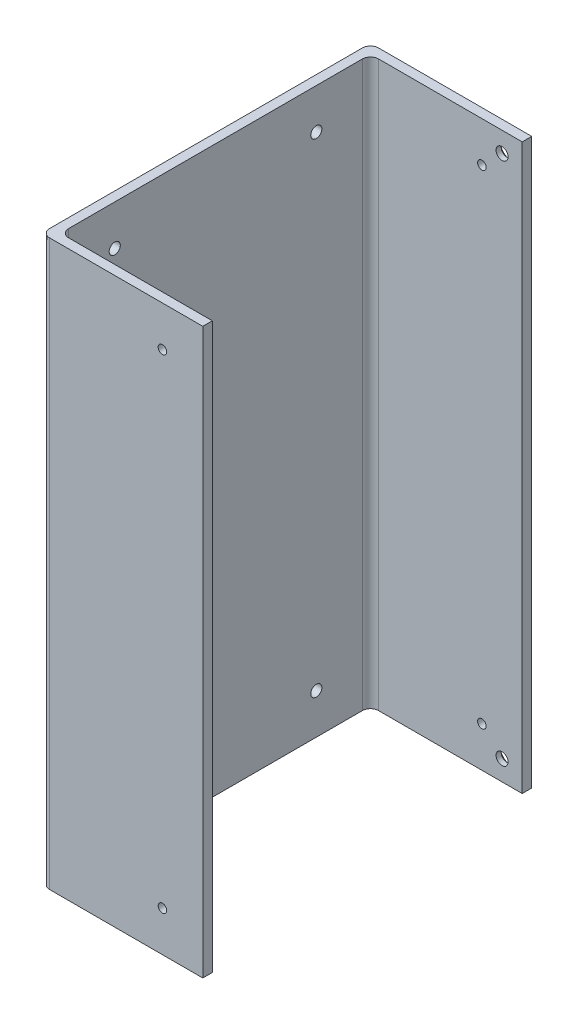
ISO-10303-21;
HEADER;
FILE_DESCRIPTION(('STEP AP214'),'2;1');
FILE_NAME('part.step','',(''),(''),'','','');
FILE_SCHEMA(('AUTOMOTIVE_DESIGN { 1 0 10303 214 1 1 1 1 }'));
ENDSEC;
DATA;
#1=APPLICATION_CONTEXT('core data for automotive mechanical design processes');
#2=APPLICATION_PROTOCOL_DEFINITION('international standard','automotive_design',2000,#1);
#3=PRODUCT_CONTEXT('',#1,'mechanical');
#4=PRODUCT('Part','Part','',(#3));
#5=PRODUCT_RELATED_PRODUCT_CATEGORY('part','',(#4));
#6=PRODUCT_DEFINITION_FORMATION('','',#4);
#7=PRODUCT_DEFINITION_CONTEXT('part definition',#1,'design');
#8=PRODUCT_DEFINITION('design','',#6,#7);
#9=PRODUCT_DEFINITION_SHAPE('','',#8);
#10=(LENGTH_UNIT() NAMED_UNIT(*) SI_UNIT(.MILLI.,.METRE.));
#11=(NAMED_UNIT(*) PLANE_ANGLE_UNIT() SI_UNIT($,.RADIAN.));
#12=(NAMED_UNIT(*) SI_UNIT($,.STERADIAN.) SOLID_ANGLE_UNIT());
#13=UNCERTAINTY_MEASURE_WITH_UNIT(LENGTH_MEASURE(1.E-05),#10,'distance_accuracy_value','');
#14=(GEOMETRIC_REPRESENTATION_CONTEXT(3) GLOBAL_UNCERTAINTY_ASSIGNED_CONTEXT((#13)) GLOBAL_UNIT_ASSIGNED_CONTEXT((#10,
#11,#12)) REPRESENTATION_CONTEXT('',''));
#15=CARTESIAN_POINT('',(0.,0.,0.));
#16=DIRECTION('',(0.,0.,1.));
#17=DIRECTION('',(1.,0.,0.));
#18=AXIS2_PLACEMENT_3D('',#15,#16,#17);
#19=CARTESIAN_POINT('',(50.8,-177.8,0.));
#20=DIRECTION('',(1.,0.,0.));
#21=DIRECTION('',(0.,0.,-1.));
#22=AXIS2_PLACEMENT_3D('',#19,#20,#21);
#23=PLANE('',#22);
#24=DIRECTION('',(0.,0.,-1.));
#25=VECTOR('',#24,1.);
#26=CARTESIAN_POINT('',(50.8,0.,0.));
#27=LINE('',#26,#25);
#28=CARTESIAN_POINT('',(50.8,0.,3.));
#29=VERTEX_POINT('',#28);
#30=CARTESIAN_POINT('',(50.8,0.,0.));
#31=VERTEX_POINT('',#30);
#32=EDGE_CURVE('E123',#29,#31,#27,.T.);
#33=ORIENTED_EDGE('',*,*,#32,.F.);
#34=DIRECTION('',(0.,1.,0.));
#35=VECTOR('',#34,1.);
#36=CARTESIAN_POINT('',(50.8,-177.8,3.));
#37=LINE('',#36,#35);
#38=CARTESIAN_POINT('',(50.8,-177.8,3.));
#39=VERTEX_POINT('',#38);
#40=EDGE_CURVE('E11',#39,#29,#37,.T.);
#41=ORIENTED_EDGE('',*,*,#40,.F.);
#42=DIRECTION('',(0.,0.,-1.));
#43=VECTOR('',#42,1.);
#44=CARTESIAN_POINT('',(50.8,-177.8,0.));
#45=LINE('',#44,#43);
#46=CARTESIAN_POINT('',(50.8,-177.8,0.));
#47=VERTEX_POINT('',#46);
#48=EDGE_CURVE('E125',#39,#47,#45,.T.);
#49=ORIENTED_EDGE('',*,*,#48,.T.);
#50=DIRECTION('',(0.,1.,0.));
#51=VECTOR('',#50,1.);
#52=CARTESIAN_POINT('',(50.8,-177.8,0.));
#53=LINE('',#52,#51);
#54=EDGE_CURVE('E120',#47,#31,#53,.T.);
#55=ORIENTED_EDGE('',*,*,#54,.T.);
#56=EDGE_LOOP('',(#33,#41,#49,#55));
#57=FACE_BOUND('',#56,.T.);
#58=ADVANCED_FACE('F34',(#57),#23,.T.);
#59=CARTESIAN_POINT('',(5.54000000000002,-177.8,3.));
#60=DIRECTION('',(0.,0.,1.));
#61=DIRECTION('',(1.,0.,0.));
#62=AXIS2_PLACEMENT_3D('',#59,#60,#61);
#63=PLANE('',#62);
#64=CARTESIAN_POINT('',(44.45,-171.45,3.));
#65=DIRECTION('',(0.,0.,1.));
#66=DIRECTION('',(1.,0.,0.));
#67=AXIS2_PLACEMENT_3D('',#64,#65,#66);
#68=CIRCLE('',#67,1.89864999999999);
#69=CARTESIAN_POINT('',(46.34865,-171.45,3.));
#70=VERTEX_POINT('',#69);
#71=EDGE_CURVE('E37',#70,#70,#68,.T.);
#72=ORIENTED_EDGE('',*,*,#71,.F.);
#73=EDGE_LOOP('',(#72));
#74=FACE_BOUND('',#73,.T.);
#75=CARTESIAN_POINT('',(44.45,-6.34999999999999,3.));
#76=DIRECTION('',(0.,0.,1.));
#77=DIRECTION('',(1.,0.,0.));
#78=AXIS2_PLACEMENT_3D('',#75,#76,#77);
#79=CIRCLE('',#78,1.89864999999999);
#80=CARTESIAN_POINT('',(46.34865,-6.34999999999999,3.));
#81=VERTEX_POINT('',#80);
#82=EDGE_CURVE('E228',#81,#81,#79,.T.);
#83=ORIENTED_EDGE('',*,*,#82,.F.);
#84=EDGE_LOOP('',(#83));
#85=FACE_BOUND('',#84,.T.);
#86=CARTESIAN_POINT('',(38.1,-12.7,3.));
#87=DIRECTION('',(0.,0.,1.));
#88=DIRECTION('',(1.,0.,0.));
#89=AXIS2_PLACEMENT_3D('',#86,#87,#88);
#90=CIRCLE('',#89,1.35255);
#91=CARTESIAN_POINT('',(39.45255,-12.7,3.));
#92=VERTEX_POINT('',#91);
#93=EDGE_CURVE('E257',#92,#92,#90,.T.);
#94=ORIENTED_EDGE('',*,*,#93,.F.);
#95=EDGE_LOOP('',(#94));
#96=FACE_BOUND('',#95,.T.);
#97=CARTESIAN_POINT('',(38.1,-165.1,3.));
#98=DIRECTION('',(0.,0.,1.));
#99=DIRECTION('',(1.,0.,0.));
#100=AXIS2_PLACEMENT_3D('',#97,#98,#99);
#101=CIRCLE('',#100,1.35255);
#102=CARTESIAN_POINT('',(39.45255,-165.1,3.));
#103=VERTEX_POINT('',#102);
#104=EDGE_CURVE('E224',#103,#103,#101,.T.);
#105=ORIENTED_EDGE('',*,*,#104,.F.);
#106=EDGE_LOOP('',(#105));
#107=FACE_BOUND('',#106,.T.);
#108=DIRECTION('',(1.,0.,0.));
#109=VECTOR('',#108,1.);
#110=CARTESIAN_POINT('',(5.54000000000002,0.,3.));
#111=LINE('',#110,#109);
#112=CARTESIAN_POINT('',(5.54000000000002,0.,3.));
#113=VERTEX_POINT('',#112);
#114=EDGE_CURVE('E142',#113,#29,#111,.T.);
#115=ORIENTED_EDGE('',*,*,#114,.F.);
#116=DIRECTION('',(0.,1.,0.));
#117=VECTOR('',#116,1.);
#118=CARTESIAN_POINT('',(5.54000000000002,-177.8,3.));
#119=LINE('',#118,#117);
#120=CARTESIAN_POINT('',(5.54000000000002,-177.8,3.));
#121=VERTEX_POINT('',#120);
#122=EDGE_CURVE('E42',#121,#113,#119,.T.);
#123=ORIENTED_EDGE('',*,*,#122,.F.);
#124=DIRECTION('',(1.,0.,0.));
#125=VECTOR('',#124,1.);
#126=CARTESIAN_POINT('',(5.54000000000002,-177.8,3.));
#127=LINE('',#126,#125);
#128=EDGE_CURVE('E130',#121,#39,#127,.T.);
#129=ORIENTED_EDGE('',*,*,#128,.T.);
#130=ORIENTED_EDGE('',*,*,#40,.T.);
#131=EDGE_LOOP('',(#115,#123,#129,#130));
#132=FACE_BOUND('',#131,.T.);
#133=ADVANCED_FACE('F324',(#74,#85,#96,#107,#132),#63,.T.);
#134=CARTESIAN_POINT('',(5.54,-177.8,5.54));
#135=DIRECTION('',(0.,1.,0.));
#136=DIRECTION('',(0.,0.,1.));
#137=AXIS2_PLACEMENT_3D('',#134,#135,#136);
#138=CYLINDRICAL_SURFACE('',#137,2.54);
#139=CARTESIAN_POINT('',(5.54,0.,5.54));
#140=DIRECTION('',(0.,-1.,0.));
#141=DIRECTION('',(0.,0.,-1.));
#142=AXIS2_PLACEMENT_3D('',#139,#140,#141);
#143=CIRCLE('',#142,2.54);
#144=CARTESIAN_POINT('',(3.,0.,5.54000000000002));
#145=VERTEX_POINT('',#144);
#146=EDGE_CURVE('E173',#145,#113,#143,.T.);
#147=ORIENTED_EDGE('',*,*,#146,.F.);
#148=DIRECTION('',(0.,1.,0.));
#149=VECTOR('',#148,1.);
#150=CARTESIAN_POINT('',(3.,-177.8,5.54000000000002));
#151=LINE('',#150,#149);
#152=CARTESIAN_POINT('',(3.,-177.8,5.54000000000002));
#153=VERTEX_POINT('',#152);
#154=EDGE_CURVE('E207',#153,#145,#151,.T.);
#155=ORIENTED_EDGE('',*,*,#154,.F.);
#156=CARTESIAN_POINT('',(5.54,-177.8,5.54));
#157=DIRECTION('',(0.,-1.,0.));
#158=DIRECTION('',(0.,0.,-1.));
#159=AXIS2_PLACEMENT_3D('',#156,#157,#158);
#160=CIRCLE('',#159,2.54);
#161=EDGE_CURVE('E203',#153,#121,#160,.T.);
#162=ORIENTED_EDGE('',*,*,#161,.T.);
#163=ORIENTED_EDGE('',*,*,#122,.T.);
#164=EDGE_LOOP('',(#147,#155,#162,#163));
#165=FACE_BOUND('',#164,.T.);
#166=ADVANCED_FACE('F323',(#165),#138,.F.);
#167=CARTESIAN_POINT('',(3.,-177.8,5.54000000000002));
#168=DIRECTION('',(1.,0.,0.));
#169=DIRECTION('',(0.,0.,-1.));
#170=AXIS2_PLACEMENT_3D('',#167,#168,#169);
#171=PLANE('',#170);
#172=CARTESIAN_POINT('',(3.,-12.7,20.066));
#173=DIRECTION('',(1.,0.,0.));
#174=DIRECTION('',(0.,0.,-1.));
#175=AXIS2_PLACEMENT_3D('',#172,#173,#174);
#176=CIRCLE('',#175,1.7526);
#177=CARTESIAN_POINT('',(3.,-12.7,18.3134));
#178=VERTEX_POINT('',#177);
#179=EDGE_CURVE('E264',#178,#178,#176,.T.);
#180=ORIENTED_EDGE('',*,*,#179,.F.);
#181=EDGE_LOOP('',(#180));
#182=FACE_BOUND('',#181,.T.);
#183=CARTESIAN_POINT('',(3.,-12.7,83.566));
#184=DIRECTION('',(1.,0.,0.));
#185=DIRECTION('',(0.,0.,-1.));
#186=AXIS2_PLACEMENT_3D('',#183,#184,#185);
#187=CIRCLE('',#186,1.7526);
#188=CARTESIAN_POINT('',(3.,-12.7,81.8134));
#189=VERTEX_POINT('',#188);
#190=EDGE_CURVE('E270',#189,#189,#187,.T.);
#191=ORIENTED_EDGE('',*,*,#190,.F.);
#192=EDGE_LOOP('',(#191));
#193=FACE_BOUND('',#192,.T.);
#194=CARTESIAN_POINT('',(3.,-165.1,83.566));
#195=DIRECTION('',(1.,0.,0.));
#196=DIRECTION('',(0.,0.,-1.));
#197=AXIS2_PLACEMENT_3D('',#194,#195,#196);
#198=CIRCLE('',#197,1.75259999999999);
#199=CARTESIAN_POINT('',(3.,-165.1,81.8134));
#200=VERTEX_POINT('',#199);
#201=EDGE_CURVE('E275',#200,#200,#198,.T.);
#202=ORIENTED_EDGE('',*,*,#201,.F.);
#203=EDGE_LOOP('',(#202));
#204=FACE_BOUND('',#203,.T.);
#205=CARTESIAN_POINT('',(3.,-165.1,20.066));
#206=DIRECTION('',(1.,0.,0.));
#207=DIRECTION('',(0.,0.,-1.));
#208=AXIS2_PLACEMENT_3D('',#205,#206,#207);
#209=CIRCLE('',#208,1.75259999999999);
#210=CARTESIAN_POINT('',(3.,-165.1,18.3134));
#211=VERTEX_POINT('',#210);
#212=EDGE_CURVE('E143',#211,#211,#209,.T.);
#213=ORIENTED_EDGE('',*,*,#212,.F.);
#214=EDGE_LOOP('',(#213));
#215=FACE_BOUND('',#214,.T.);
#216=DIRECTION('',(0.,0.,-1.));
#217=VECTOR('',#216,1.);
#218=CARTESIAN_POINT('',(3.,0.,5.54000000000002));
#219=LINE('',#218,#217);
#220=CARTESIAN_POINT('',(3.,0.,98.092));
#221=VERTEX_POINT('',#220);
#222=EDGE_CURVE('E170',#221,#145,#219,.T.);
#223=ORIENTED_EDGE('',*,*,#222,.F.);
#224=DIRECTION('',(0.,1.,0.));
#225=VECTOR('',#224,1.);
#226=CARTESIAN_POINT('',(3.,-177.8,98.092));
#227=LINE('',#226,#225);
#228=CARTESIAN_POINT('',(3.,-177.8,98.092));
#229=VERTEX_POINT('',#228);
#230=EDGE_CURVE('E209',#229,#221,#227,.T.);
#231=ORIENTED_EDGE('',*,*,#230,.F.);
#232=DIRECTION('',(0.,0.,-1.));
#233=VECTOR('',#232,1.);
#234=CARTESIAN_POINT('',(3.,-177.8,5.54000000000002));
#235=LINE('',#234,#233);
#236=EDGE_CURVE('E200',#229,#153,#235,.T.);
#237=ORIENTED_EDGE('',*,*,#236,.T.);
#238=ORIENTED_EDGE('',*,*,#154,.T.);
#239=EDGE_LOOP('',(#223,#231,#237,#238));
#240=FACE_BOUND('',#239,.T.);
#241=ADVANCED_FACE('F319',(#182,#193,#204,#215,#240),#171,.T.);
#242=CARTESIAN_POINT('',(5.54,-177.8,98.092));
#243=DIRECTION('',(0.,1.,0.));
#244=DIRECTION('',(0.,0.,1.));
#245=AXIS2_PLACEMENT_3D('',#242,#243,#244);
#246=CYLINDRICAL_SURFACE('',#245,2.54);
#247=CARTESIAN_POINT('',(5.54,0.,98.092));
#248=DIRECTION('',(0.,-1.,0.));
#249=DIRECTION('',(0.,0.,-1.));
#250=AXIS2_PLACEMENT_3D('',#247,#248,#249);
#251=CIRCLE('',#250,2.54);
#252=CARTESIAN_POINT('',(5.54000000000002,0.,100.632));
#253=VERTEX_POINT('',#252);
#254=EDGE_CURVE('E167',#253,#221,#251,.T.);
#255=ORIENTED_EDGE('',*,*,#254,.F.);
#256=DIRECTION('',(0.,1.,0.));
#257=VECTOR('',#256,1.);
#258=CARTESIAN_POINT('',(5.54000000000002,-177.8,100.632));
#259=LINE('',#258,#257);
#260=CARTESIAN_POINT('',(5.54000000000002,-177.8,100.632));
#261=VERTEX_POINT('',#260);
#262=EDGE_CURVE('E211',#261,#253,#259,.T.);
#263=ORIENTED_EDGE('',*,*,#262,.F.);
#264=CARTESIAN_POINT('',(5.54,-177.8,98.092));
#265=DIRECTION('',(0.,-1.,0.));
#266=DIRECTION('',(0.,0.,-1.));
#267=AXIS2_PLACEMENT_3D('',#264,#265,#266);
#268=CIRCLE('',#267,2.54);
#269=EDGE_CURVE('E197',#261,#229,#268,.T.);
#270=ORIENTED_EDGE('',*,*,#269,.T.);
#271=ORIENTED_EDGE('',*,*,#230,.T.);
#272=EDGE_LOOP('',(#255,#263,#270,#271));
#273=FACE_BOUND('',#272,.T.);
#274=ADVANCED_FACE('F315',(#273),#246,.F.);
#275=CARTESIAN_POINT('',(5.54000000000002,-177.8,100.632));
#276=DIRECTION('',(0.,0.,-1.));
#277=DIRECTION('',(-1.,0.,0.));
#278=AXIS2_PLACEMENT_3D('',#275,#276,#277);
#279=PLANE('',#278);
#280=CARTESIAN_POINT('',(38.1,-12.7,100.632));
#281=DIRECTION('',(0.,0.,-1.));
#282=DIRECTION('',(-1.,0.,0.));
#283=AXIS2_PLACEMENT_3D('',#280,#281,#282);
#284=CIRCLE('',#283,1.35254999999999);
#285=CARTESIAN_POINT('',(36.74745,-12.7,100.632));
#286=VERTEX_POINT('',#285);
#287=EDGE_CURVE('E235',#286,#286,#284,.T.);
#288=ORIENTED_EDGE('',*,*,#287,.F.);
#289=EDGE_LOOP('',(#288));
#290=FACE_BOUND('',#289,.T.);
#291=CARTESIAN_POINT('',(38.1,-165.1,100.632));
#292=DIRECTION('',(0.,0.,-1.));
#293=DIRECTION('',(-1.,0.,0.));
#294=AXIS2_PLACEMENT_3D('',#291,#292,#293);
#295=CIRCLE('',#294,1.35254999999999);
#296=CARTESIAN_POINT('',(36.74745,-165.1,100.632));
#297=VERTEX_POINT('',#296);
#298=EDGE_CURVE('E251',#297,#297,#295,.T.);
#299=ORIENTED_EDGE('',*,*,#298,.F.);
#300=EDGE_LOOP('',(#299));
#301=FACE_BOUND('',#300,.T.);
#302=DIRECTION('',(-1.,0.,0.));
#303=VECTOR('',#302,1.);
#304=CARTESIAN_POINT('',(5.54000000000002,0.,100.632));
#305=LINE('',#304,#303);
#306=CARTESIAN_POINT('',(50.8,0.,100.632));
#307=VERTEX_POINT('',#306);
#308=EDGE_CURVE('E164',#307,#253,#305,.T.);
#309=ORIENTED_EDGE('',*,*,#308,.F.);
#310=DIRECTION('',(0.,1.,0.));
#311=VECTOR('',#310,1.);
#312=CARTESIAN_POINT('',(50.8,-177.8,100.632));
#313=LINE('',#312,#311);
#314=CARTESIAN_POINT('',(50.8,-177.8,100.632));
#315=VERTEX_POINT('',#314);
#316=EDGE_CURVE('E213',#315,#307,#313,.T.);
#317=ORIENTED_EDGE('',*,*,#316,.F.);
#318=DIRECTION('',(-1.,0.,0.));
#319=VECTOR('',#318,1.);
#320=CARTESIAN_POINT('',(5.54000000000002,-177.8,100.632));
#321=LINE('',#320,#319);
#322=EDGE_CURVE('E194',#315,#261,#321,.T.);
#323=ORIENTED_EDGE('',*,*,#322,.T.);
#324=ORIENTED_EDGE('',*,*,#262,.T.);
#325=EDGE_LOOP('',(#309,#317,#323,#324));
#326=FACE_BOUND('',#325,.T.);
#327=ADVANCED_FACE('F311',(#290,#301,#326),#279,.T.);
#328=CARTESIAN_POINT('',(50.8,-177.8,100.632));
#329=DIRECTION('',(1.,0.,0.));
#330=DIRECTION('',(0.,0.,-1.));
#331=AXIS2_PLACEMENT_3D('',#328,#329,#330);
#332=PLANE('',#331);
#333=DIRECTION('',(0.,0.,-1.));
#334=VECTOR('',#333,1.);
#335=CARTESIAN_POINT('',(50.8,0.,100.632));
#336=LINE('',#335,#334);
#337=CARTESIAN_POINT('',(50.8,0.,103.632));
#338=VERTEX_POINT('',#337);
#339=EDGE_CURVE('E161',#338,#307,#336,.T.);
#340=ORIENTED_EDGE('',*,*,#339,.F.);
#341=DIRECTION('',(0.,1.,0.));
#342=VECTOR('',#341,1.);
#343=CARTESIAN_POINT('',(50.8,-177.8,103.632));
#344=LINE('',#343,#342);
#345=CARTESIAN_POINT('',(50.8,-177.8,103.632));
#346=VERTEX_POINT('',#345);
#347=EDGE_CURVE('E215',#346,#338,#344,.T.);
#348=ORIENTED_EDGE('',*,*,#347,.F.);
#349=DIRECTION('',(0.,0.,-1.));
#350=VECTOR('',#349,1.);
#351=CARTESIAN_POINT('',(50.8,-177.8,100.632));
#352=LINE('',#351,#350);
#353=EDGE_CURVE('E191',#346,#315,#352,.T.);
#354=ORIENTED_EDGE('',*,*,#353,.T.);
#355=ORIENTED_EDGE('',*,*,#316,.T.);
#356=EDGE_LOOP('',(#340,#348,#354,#355));
#357=FACE_BOUND('',#356,.T.);
#358=ADVANCED_FACE('F307',(#357),#332,.T.);
#359=CARTESIAN_POINT('',(2.54000000000003,-177.8,103.632));
#360=DIRECTION('',(0.,0.,1.));
#361=DIRECTION('',(1.,0.,0.));
#362=AXIS2_PLACEMENT_3D('',#359,#360,#361);
#363=PLANE('',#362);
#364=CARTESIAN_POINT('',(38.1,-12.7,103.632));
#365=DIRECTION('',(0.,0.,1.));
#366=DIRECTION('',(1.,0.,0.));
#367=AXIS2_PLACEMENT_3D('',#364,#365,#366);
#368=CIRCLE('',#367,1.35254999999999);
#369=CARTESIAN_POINT('',(39.45255,-12.7,103.632));
#370=VERTEX_POINT('',#369);
#371=EDGE_CURVE('E230',#370,#370,#368,.T.);
#372=ORIENTED_EDGE('',*,*,#371,.F.);
#373=EDGE_LOOP('',(#372));
#374=FACE_BOUND('',#373,.T.);
#375=CARTESIAN_POINT('',(38.1,-165.1,103.632));
#376=DIRECTION('',(0.,0.,1.));
#377=DIRECTION('',(1.,0.,0.));
#378=AXIS2_PLACEMENT_3D('',#375,#376,#377);
#379=CIRCLE('',#378,1.35254999999999);
#380=CARTESIAN_POINT('',(39.45255,-165.1,103.632));
#381=VERTEX_POINT('',#380);
#382=EDGE_CURVE('E248',#381,#381,#379,.T.);
#383=ORIENTED_EDGE('',*,*,#382,.F.);
#384=EDGE_LOOP('',(#383));
#385=FACE_BOUND('',#384,.T.);
#386=DIRECTION('',(1.,0.,0.));
#387=VECTOR('',#386,1.);
#388=CARTESIAN_POINT('',(2.54000000000003,0.,103.632));
#389=LINE('',#388,#387);
#390=CARTESIAN_POINT('',(2.54000000000003,0.,103.632));
#391=VERTEX_POINT('',#390);
#392=EDGE_CURVE('E158',#391,#338,#389,.T.);
#393=ORIENTED_EDGE('',*,*,#392,.F.);
#394=DIRECTION('',(0.,1.,0.));
#395=VECTOR('',#394,1.);
#396=CARTESIAN_POINT('',(2.54000000000003,-177.8,103.632));
#397=LINE('',#396,#395);
#398=CARTESIAN_POINT('',(2.54000000000003,-177.8,103.632));
#399=VERTEX_POINT('',#398);
#400=EDGE_CURVE('E217',#399,#391,#397,.T.);
#401=ORIENTED_EDGE('',*,*,#400,.F.);
#402=DIRECTION('',(1.,0.,0.));
#403=VECTOR('',#402,1.);
#404=CARTESIAN_POINT('',(2.54000000000003,-177.8,103.632));
#405=LINE('',#404,#403);
#406=EDGE_CURVE('E188',#399,#346,#405,.T.);
#407=ORIENTED_EDGE('',*,*,#406,.T.);
#408=ORIENTED_EDGE('',*,*,#347,.T.);
#409=EDGE_LOOP('',(#393,#401,#407,#408));
#410=FACE_BOUND('',#409,.T.);
#411=ADVANCED_FACE('F305',(#374,#385,#410),#363,.T.);
#412=CARTESIAN_POINT('',(2.54000000000001,-177.8,101.092));
#413=DIRECTION('',(0.,1.,0.));
#414=DIRECTION('',(0.,0.,1.));
#415=AXIS2_PLACEMENT_3D('',#412,#413,#414);
#416=CYLINDRICAL_SURFACE('',#415,2.54);
#417=CARTESIAN_POINT('',(2.54000000000001,0.,101.092));
#418=DIRECTION('',(0.,1.,0.));
#419=DIRECTION('',(0.,0.,1.));
#420=AXIS2_PLACEMENT_3D('',#417,#418,#419);
#421=CIRCLE('',#420,2.54);
#422=CARTESIAN_POINT('',(0.,0.,101.092));
#423=VERTEX_POINT('',#422);
#424=EDGE_CURVE('E155',#423,#391,#421,.T.);
#425=ORIENTED_EDGE('',*,*,#424,.F.);
#426=DIRECTION('',(0.,1.,0.));
#427=VECTOR('',#426,1.);
#428=CARTESIAN_POINT('',(0.,-177.8,101.092));
#429=LINE('',#428,#427);
#430=CARTESIAN_POINT('',(0.,-177.8,101.092));
#431=VERTEX_POINT('',#430);
#432=EDGE_CURVE('E219',#431,#423,#429,.T.);
#433=ORIENTED_EDGE('',*,*,#432,.F.);
#434=CARTESIAN_POINT('',(2.54000000000001,-177.8,101.092));
#435=DIRECTION('',(0.,1.,0.));
#436=DIRECTION('',(0.,0.,1.));
#437=AXIS2_PLACEMENT_3D('',#434,#435,#436);
#438=CIRCLE('',#437,2.54);
#439=EDGE_CURVE('E185',#431,#399,#438,.T.);
#440=ORIENTED_EDGE('',*,*,#439,.T.);
#441=ORIENTED_EDGE('',*,*,#400,.T.);
#442=EDGE_LOOP('',(#425,#433,#440,#441));
#443=FACE_BOUND('',#442,.T.);
#444=ADVANCED_FACE('F288',(#443),#416,.T.);
#445=CARTESIAN_POINT('',(0.,-177.8,2.54000000000002));
#446=DIRECTION('',(-1.,0.,0.));
#447=DIRECTION('',(0.,0.,1.));
#448=AXIS2_PLACEMENT_3D('',#445,#446,#447);
#449=PLANE('',#448);
#450=CARTESIAN_POINT('',(0.,-12.7,20.066));
#451=DIRECTION('',(-1.,0.,0.));
#452=DIRECTION('',(0.,0.,1.));
#453=AXIS2_PLACEMENT_3D('',#450,#451,#452);
#454=CIRCLE('',#453,1.7526);
#455=CARTESIAN_POINT('',(0.,-12.7,21.8186));
#456=VERTEX_POINT('',#455);
#457=EDGE_CURVE('E226',#456,#456,#454,.T.);
#458=ORIENTED_EDGE('',*,*,#457,.F.);
#459=EDGE_LOOP('',(#458));
#460=FACE_BOUND('',#459,.T.);
#461=CARTESIAN_POINT('',(0.,-12.7,83.566));
#462=DIRECTION('',(-1.,0.,0.));
#463=DIRECTION('',(0.,0.,1.));
#464=AXIS2_PLACEMENT_3D('',#461,#462,#463);
#465=CIRCLE('',#464,1.7526);
#466=CARTESIAN_POINT('',(0.,-12.7,85.3186));
#467=VERTEX_POINT('',#466);
#468=EDGE_CURVE('E267',#467,#467,#465,.T.);
#469=ORIENTED_EDGE('',*,*,#468,.F.);
#470=EDGE_LOOP('',(#469));
#471=FACE_BOUND('',#470,.T.);
#472=CARTESIAN_POINT('',(0.,-165.1,83.566));
#473=DIRECTION('',(-1.,0.,0.));
#474=DIRECTION('',(0.,0.,1.));
#475=AXIS2_PLACEMENT_3D('',#472,#473,#474);
#476=CIRCLE('',#475,1.75259999999999);
#477=CARTESIAN_POINT('',(0.,-165.1,85.3186));
#478=VERTEX_POINT('',#477);
#479=EDGE_CURVE('E273',#478,#478,#476,.T.);
#480=ORIENTED_EDGE('',*,*,#479,.F.);
#481=EDGE_LOOP('',(#480));
#482=FACE_BOUND('',#481,.T.);
#483=CARTESIAN_POINT('',(0.,-165.1,20.066));
#484=DIRECTION('',(-1.,0.,0.));
#485=DIRECTION('',(0.,0.,1.));
#486=AXIS2_PLACEMENT_3D('',#483,#484,#485);
#487=CIRCLE('',#486,1.75259999999999);
#488=CARTESIAN_POINT('',(0.,-165.1,21.8186));
#489=VERTEX_POINT('',#488);
#490=EDGE_CURVE('E146',#489,#489,#487,.T.);
#491=ORIENTED_EDGE('',*,*,#490,.F.);
#492=EDGE_LOOP('',(#491));
#493=FACE_BOUND('',#492,.T.);
#494=DIRECTION('',(0.,0.,1.));
#495=VECTOR('',#494,1.);
#496=CARTESIAN_POINT('',(0.,0.,2.54000000000002));
#497=LINE('',#496,#495);
#498=CARTESIAN_POINT('',(0.,0.,2.54000000000002));
#499=VERTEX_POINT('',#498);
#500=EDGE_CURVE('E152',#499,#423,#497,.T.);
#501=ORIENTED_EDGE('',*,*,#500,.F.);
#502=DIRECTION('',(0.,1.,0.));
#503=VECTOR('',#502,1.);
#504=CARTESIAN_POINT('',(0.,-177.8,2.54000000000002));
#505=LINE('',#504,#503);
#506=CARTESIAN_POINT('',(0.,-177.8,2.54000000000002));
#507=VERTEX_POINT('',#506);
#508=EDGE_CURVE('E221',#507,#499,#505,.T.);
#509=ORIENTED_EDGE('',*,*,#508,.F.);
#510=DIRECTION('',(0.,0.,1.));
#511=VECTOR('',#510,1.);
#512=CARTESIAN_POINT('',(0.,-177.8,2.54000000000002));
#513=LINE('',#512,#511);
#514=EDGE_CURVE('E182',#507,#431,#513,.T.);
#515=ORIENTED_EDGE('',*,*,#514,.T.);
#516=ORIENTED_EDGE('',*,*,#432,.T.);
#517=EDGE_LOOP('',(#501,#509,#515,#516));
#518=FACE_BOUND('',#517,.T.);
#519=ADVANCED_FACE('F284',(#460,#471,#482,#493,#518),#449,.T.);
#520=CARTESIAN_POINT('',(2.54,-177.8,2.54));
#521=DIRECTION('',(0.,1.,0.));
#522=DIRECTION('',(0.,0.,1.));
#523=AXIS2_PLACEMENT_3D('',#520,#521,#522);
#524=CYLINDRICAL_SURFACE('',#523,2.54);
#525=CARTESIAN_POINT('',(2.54,0.,2.54));
#526=DIRECTION('',(0.,1.,0.));
#527=DIRECTION('',(0.,0.,-1.));
#528=AXIS2_PLACEMENT_3D('',#525,#526,#527);
#529=CIRCLE('',#528,2.54);
#530=CARTESIAN_POINT('',(2.54000000000002,0.,0.));
#531=VERTEX_POINT('',#530);
#532=EDGE_CURVE('E138',#531,#499,#529,.T.);
#533=ORIENTED_EDGE('',*,*,#532,.F.);
#534=DIRECTION('',(0.,1.,0.));
#535=VECTOR('',#534,1.);
#536=CARTESIAN_POINT('',(2.54000000000002,-177.8,0.));
#537=LINE('',#536,#535);
#538=CARTESIAN_POINT('',(2.54000000000002,-177.8,0.));
#539=VERTEX_POINT('',#538);
#540=EDGE_CURVE('E129',#539,#531,#537,.T.);
#541=ORIENTED_EDGE('',*,*,#540,.F.);
#542=CARTESIAN_POINT('',(2.54,-177.8,2.54));
#543=DIRECTION('',(0.,1.,0.));
#544=DIRECTION('',(0.,0.,-1.));
#545=AXIS2_PLACEMENT_3D('',#542,#543,#544);
#546=CIRCLE('',#545,2.54);
#547=EDGE_CURVE('E179',#539,#507,#546,.T.);
#548=ORIENTED_EDGE('',*,*,#547,.T.);
#549=ORIENTED_EDGE('',*,*,#508,.T.);
#550=EDGE_LOOP('',(#533,#541,#548,#549));
#551=FACE_BOUND('',#550,.T.);
#552=ADVANCED_FACE('F287',(#551),#524,.T.);
#553=CARTESIAN_POINT('',(2.54000000000002,-177.8,0.));
#554=DIRECTION('',(0.,0.,-1.));
#555=DIRECTION('',(-1.,0.,0.));
#556=AXIS2_PLACEMENT_3D('',#553,#554,#555);
#557=PLANE('',#556);
#558=CARTESIAN_POINT('',(44.45,-171.45,0.));
#559=DIRECTION('',(0.,0.,-1.));
#560=DIRECTION('',(-1.,0.,0.));
#561=AXIS2_PLACEMENT_3D('',#558,#559,#560);
#562=CIRCLE('',#561,3.5433);
#563=CARTESIAN_POINT('',(40.9067,-171.45,0.));
#564=VERTEX_POINT('',#563);
#565=EDGE_CURVE('E363',#564,#564,#562,.T.);
#566=ORIENTED_EDGE('',*,*,#565,.F.);
#567=EDGE_LOOP('',(#566));
#568=FACE_BOUND('',#567,.T.);
#569=CARTESIAN_POINT('',(44.45,-6.34999999999999,0.));
#570=DIRECTION('',(0.,0.,-1.));
#571=DIRECTION('',(-1.,0.,0.));
#572=AXIS2_PLACEMENT_3D('',#569,#570,#571);
#573=CIRCLE('',#572,3.5433);
#574=CARTESIAN_POINT('',(40.9067,-6.34999999999999,0.));
#575=VERTEX_POINT('',#574);
#576=EDGE_CURVE('E231',#575,#575,#573,.T.);
#577=ORIENTED_EDGE('',*,*,#576,.F.);
#578=EDGE_LOOP('',(#577));
#579=FACE_BOUND('',#578,.T.);
#580=CARTESIAN_POINT('',(38.1,-12.7,0.));
#581=DIRECTION('',(0.,0.,-1.));
#582=DIRECTION('',(-1.,0.,0.));
#583=AXIS2_PLACEMENT_3D('',#580,#581,#582);
#584=CIRCLE('',#583,1.35255);
#585=CARTESIAN_POINT('',(36.74745,-12.7,0.));
#586=VERTEX_POINT('',#585);
#587=EDGE_CURVE('E254',#586,#586,#584,.T.);
#588=ORIENTED_EDGE('',*,*,#587,.F.);
#589=EDGE_LOOP('',(#588));
#590=FACE_BOUND('',#589,.T.);
#591=CARTESIAN_POINT('',(38.1,-165.1,0.));
#592=DIRECTION('',(0.,0.,-1.));
#593=DIRECTION('',(-1.,0.,0.));
#594=AXIS2_PLACEMENT_3D('',#591,#592,#593);
#595=CIRCLE('',#594,1.35255);
#596=CARTESIAN_POINT('',(36.74745,-165.1,0.));
#597=VERTEX_POINT('',#596);
#598=EDGE_CURVE('E227',#597,#597,#595,.T.);
#599=ORIENTED_EDGE('',*,*,#598,.F.);
#600=EDGE_LOOP('',(#599));
#601=FACE_BOUND('',#600,.T.);
#602=DIRECTION('',(-1.,0.,0.));
#603=VECTOR('',#602,1.);
#604=CARTESIAN_POINT('',(2.54000000000002,0.,0.));
#605=LINE('',#604,#603);
#606=EDGE_CURVE('E133',#31,#531,#605,.T.);
#607=ORIENTED_EDGE('',*,*,#606,.F.);
#608=ORIENTED_EDGE('',*,*,#54,.F.);
#609=DIRECTION('',(-1.,0.,0.));
#610=VECTOR('',#609,1.);
#611=CARTESIAN_POINT('',(2.54000000000002,-177.8,0.));
#612=LINE('',#611,#610);
#613=EDGE_CURVE('E177',#47,#539,#612,.T.);
#614=ORIENTED_EDGE('',*,*,#613,.T.);
#615=ORIENTED_EDGE('',*,*,#540,.T.);
#616=EDGE_LOOP('',(#607,#608,#614,#615));
#617=FACE_BOUND('',#616,.T.);
#618=ADVANCED_FACE('F134',(#568,#579,#590,#601,#617),#557,.T.);
#619=CARTESIAN_POINT('',(5.54,-177.8,5.54));
#620=DIRECTION('',(0.,-1.,0.));
#621=DIRECTION('',(0.,0.,-1.));
#622=AXIS2_PLACEMENT_3D('',#619,#620,#621);
#623=PLANE('',#622);
#624=ORIENTED_EDGE('',*,*,#48,.F.);
#625=ORIENTED_EDGE('',*,*,#128,.F.);
#626=ORIENTED_EDGE('',*,*,#161,.F.);
#627=ORIENTED_EDGE('',*,*,#236,.F.);
#628=ORIENTED_EDGE('',*,*,#269,.F.);
#629=ORIENTED_EDGE('',*,*,#322,.F.);
#630=ORIENTED_EDGE('',*,*,#353,.F.);
#631=ORIENTED_EDGE('',*,*,#406,.F.);
#632=ORIENTED_EDGE('',*,*,#439,.F.);
#633=ORIENTED_EDGE('',*,*,#514,.F.);
#634=ORIENTED_EDGE('',*,*,#547,.F.);
#635=ORIENTED_EDGE('',*,*,#613,.F.);
#636=EDGE_LOOP('',(#624,#625,#626,#627,#628,#629,#630,#631,#632,#633,#634,#635));
#637=FACE_BOUND('',#636,.T.);
#638=ADVANCED_FACE('F297',(#637),#623,.T.);
#639=CARTESIAN_POINT('',(5.54,0.,5.54));
#640=DIRECTION('',(0.,-1.,0.));
#641=DIRECTION('',(0.,0.,-1.));
#642=AXIS2_PLACEMENT_3D('',#639,#640,#641);
#643=PLANE('',#642);
#644=ORIENTED_EDGE('',*,*,#32,.T.);
#645=ORIENTED_EDGE('',*,*,#606,.T.);
#646=ORIENTED_EDGE('',*,*,#532,.T.);
#647=ORIENTED_EDGE('',*,*,#500,.T.);
#648=ORIENTED_EDGE('',*,*,#424,.T.);
#649=ORIENTED_EDGE('',*,*,#392,.T.);
#650=ORIENTED_EDGE('',*,*,#339,.T.);
#651=ORIENTED_EDGE('',*,*,#308,.T.);
#652=ORIENTED_EDGE('',*,*,#254,.T.);
#653=ORIENTED_EDGE('',*,*,#222,.T.);
#654=ORIENTED_EDGE('',*,*,#146,.T.);
#655=ORIENTED_EDGE('',*,*,#114,.T.);
#656=EDGE_LOOP('',(#644,#645,#646,#647,#648,#649,#650,#651,#652,#653,#654,#655));
#657=FACE_BOUND('',#656,.T.);
#658=ADVANCED_FACE('F140',(#657),#643,.F.);
#659=CARTESIAN_POINT('',(0.,-165.1,20.066));
#660=DIRECTION('',(-1.,0.,0.));
#661=DIRECTION('',(0.,0.,1.));
#662=AXIS2_PLACEMENT_3D('',#659,#660,#661);
#663=CYLINDRICAL_SURFACE('',#662,1.75259999999999);
#664=ORIENTED_EDGE('',*,*,#212,.T.);
#665=EDGE_LOOP('',(#664));
#666=FACE_BOUND('',#665,.T.);
#667=ORIENTED_EDGE('',*,*,#490,.T.);
#668=EDGE_LOOP('',(#667));
#669=FACE_BOUND('',#668,.T.);
#670=ADVANCED_FACE('F282',(#666,#669),#663,.F.);
#671=CARTESIAN_POINT('',(0.,-165.1,83.566));
#672=DIRECTION('',(-1.,0.,0.));
#673=DIRECTION('',(0.,0.,1.));
#674=AXIS2_PLACEMENT_3D('',#671,#672,#673);
#675=CYLINDRICAL_SURFACE('',#674,1.75259999999999);
#676=ORIENTED_EDGE('',*,*,#201,.T.);
#677=EDGE_LOOP('',(#676));
#678=FACE_BOUND('',#677,.T.);
#679=ORIENTED_EDGE('',*,*,#479,.T.);
#680=EDGE_LOOP('',(#679));
#681=FACE_BOUND('',#680,.T.);
#682=ADVANCED_FACE('F389',(#678,#681),#675,.F.);
#683=CARTESIAN_POINT('',(0.,-12.7,83.566));
#684=DIRECTION('',(-1.,0.,0.));
#685=DIRECTION('',(0.,0.,1.));
#686=AXIS2_PLACEMENT_3D('',#683,#684,#685);
#687=CYLINDRICAL_SURFACE('',#686,1.7526);
#688=ORIENTED_EDGE('',*,*,#190,.T.);
#689=EDGE_LOOP('',(#688));
#690=FACE_BOUND('',#689,.T.);
#691=ORIENTED_EDGE('',*,*,#468,.T.);
#692=EDGE_LOOP('',(#691));
#693=FACE_BOUND('',#692,.T.);
#694=ADVANCED_FACE('F382',(#690,#693),#687,.F.);
#695=CARTESIAN_POINT('',(0.,-12.7,20.066));
#696=DIRECTION('',(-1.,0.,0.));
#697=DIRECTION('',(0.,0.,1.));
#698=AXIS2_PLACEMENT_3D('',#695,#696,#697);
#699=CYLINDRICAL_SURFACE('',#698,1.7526);
#700=ORIENTED_EDGE('',*,*,#179,.T.);
#701=EDGE_LOOP('',(#700));
#702=FACE_BOUND('',#701,.T.);
#703=ORIENTED_EDGE('',*,*,#457,.T.);
#704=EDGE_LOOP('',(#703));
#705=FACE_BOUND('',#704,.T.);
#706=ADVANCED_FACE('F372',(#702,#705),#699,.F.);
#707=CARTESIAN_POINT('',(38.1,-165.1,0.));
#708=DIRECTION('',(0.,0.,-1.));
#709=DIRECTION('',(-1.,0.,0.));
#710=AXIS2_PLACEMENT_3D('',#707,#708,#709);
#711=CYLINDRICAL_SURFACE('',#710,1.35255);
#712=ORIENTED_EDGE('',*,*,#104,.T.);
#713=EDGE_LOOP('',(#712));
#714=FACE_BOUND('',#713,.T.);
#715=ORIENTED_EDGE('',*,*,#598,.T.);
#716=EDGE_LOOP('',(#715));
#717=FACE_BOUND('',#716,.T.);
#718=ADVANCED_FACE('F369',(#714,#717),#711,.F.);
#719=CARTESIAN_POINT('',(38.1,-12.7,0.));
#720=DIRECTION('',(0.,0.,-1.));
#721=DIRECTION('',(-1.,0.,0.));
#722=AXIS2_PLACEMENT_3D('',#719,#720,#721);
#723=CYLINDRICAL_SURFACE('',#722,1.35255);
#724=ORIENTED_EDGE('',*,*,#93,.T.);
#725=EDGE_LOOP('',(#724));
#726=FACE_BOUND('',#725,.T.);
#727=ORIENTED_EDGE('',*,*,#587,.T.);
#728=EDGE_LOOP('',(#727));
#729=FACE_BOUND('',#728,.T.);
#730=ADVANCED_FACE('F371',(#726,#729),#723,.F.);
#731=CARTESIAN_POINT('',(38.1,-165.1,103.632));
#732=DIRECTION('',(0.,0.,1.));
#733=DIRECTION('',(1.,0.,0.));
#734=AXIS2_PLACEMENT_3D('',#731,#732,#733);
#735=CYLINDRICAL_SURFACE('',#734,1.35254999999999);
#736=ORIENTED_EDGE('',*,*,#298,.T.);
#737=EDGE_LOOP('',(#736));
#738=FACE_BOUND('',#737,.T.);
#739=ORIENTED_EDGE('',*,*,#382,.T.);
#740=EDGE_LOOP('',(#739));
#741=FACE_BOUND('',#740,.T.);
#742=ADVANCED_FACE('F379',(#738,#741),#735,.F.);
#743=CARTESIAN_POINT('',(38.1,-12.7,103.632));
#744=DIRECTION('',(0.,0.,1.));
#745=DIRECTION('',(1.,0.,0.));
#746=AXIS2_PLACEMENT_3D('',#743,#744,#745);
#747=CYLINDRICAL_SURFACE('',#746,1.35254999999999);
#748=ORIENTED_EDGE('',*,*,#287,.T.);
#749=EDGE_LOOP('',(#748));
#750=FACE_BOUND('',#749,.T.);
#751=ORIENTED_EDGE('',*,*,#371,.T.);
#752=EDGE_LOOP('',(#751));
#753=FACE_BOUND('',#752,.T.);
#754=ADVANCED_FACE('F456',(#750,#753),#747,.F.);
#755=CARTESIAN_POINT('',(44.45,-6.34999999999999,0.));
#756=DIRECTION('',(0.,0.,-1.));
#757=DIRECTION('',(-1.,0.,0.));
#758=AXIS2_PLACEMENT_3D('',#755,#756,#757);
#759=CONICAL_SURFACE('',#758,3.5433,0.872664625997165);
#760=CARTESIAN_POINT('',(44.45,-6.34999999999999,1.38002520841572));
#761=DIRECTION('',(0.,0.,-1.));
#762=DIRECTION('',(-1.,0.,0.));
#763=AXIS2_PLACEMENT_3D('',#760,#761,#762);
#764=CIRCLE('',#763,1.89864999999999);
#765=CARTESIAN_POINT('',(42.55135,-6.34999999999999,1.38002520841572));
#766=VERTEX_POINT('',#765);
#767=EDGE_CURVE('E238',#766,#766,#764,.T.);
#768=ORIENTED_EDGE('',*,*,#767,.F.);
#769=EDGE_LOOP('',(#768));
#770=FACE_BOUND('',#769,.T.);
#771=ORIENTED_EDGE('',*,*,#576,.T.);
#772=EDGE_LOOP('',(#771));
#773=FACE_BOUND('',#772,.T.);
#774=ADVANCED_FACE('F465',(#770,#773),#759,.F.);
#775=CARTESIAN_POINT('',(44.45,-6.34999999999999,0.));
#776=DIRECTION('',(0.,0.,-1.));
#777=DIRECTION('',(-1.,0.,0.));
#778=AXIS2_PLACEMENT_3D('',#775,#776,#777);
#779=CYLINDRICAL_SURFACE('',#778,1.89864999999999);
#780=ORIENTED_EDGE('',*,*,#82,.T.);
#781=EDGE_LOOP('',(#780));
#782=FACE_BOUND('',#781,.T.);
#783=ORIENTED_EDGE('',*,*,#767,.T.);
#784=EDGE_LOOP('',(#783));
#785=FACE_BOUND('',#784,.T.);
#786=ADVANCED_FACE('F488',(#782,#785),#779,.F.);
#787=CARTESIAN_POINT('',(44.45,-171.45,0.));
#788=DIRECTION('',(0.,0.,-1.));
#789=DIRECTION('',(-1.,0.,0.));
#790=AXIS2_PLACEMENT_3D('',#787,#788,#789);
#791=CONICAL_SURFACE('',#790,3.5433,0.872664625997165);
#792=CARTESIAN_POINT('',(44.45,-171.45,1.38002520841572));
#793=DIRECTION('',(0.,0.,-1.));
#794=DIRECTION('',(-1.,0.,0.));
#795=AXIS2_PLACEMENT_3D('',#792,#793,#794);
#796=CIRCLE('',#795,1.89864999999999);
#797=CARTESIAN_POINT('',(42.55135,-171.45,1.38002520841572));
#798=VERTEX_POINT('',#797);
#799=EDGE_CURVE('E525',#798,#798,#796,.T.);
#800=ORIENTED_EDGE('',*,*,#799,.F.);
#801=EDGE_LOOP('',(#800));
#802=FACE_BOUND('',#801,.T.);
#803=ORIENTED_EDGE('',*,*,#565,.T.);
#804=EDGE_LOOP('',(#803));
#805=FACE_BOUND('',#804,.T.);
#806=ADVANCED_FACE('F498',(#802,#805),#791,.F.);
#807=CARTESIAN_POINT('',(44.45,-171.45,0.));
#808=DIRECTION('',(0.,0.,-1.));
#809=DIRECTION('',(-1.,0.,0.));
#810=AXIS2_PLACEMENT_3D('',#807,#808,#809);
#811=CYLINDRICAL_SURFACE('',#810,1.89864999999999);
#812=ORIENTED_EDGE('',*,*,#71,.T.);
#813=EDGE_LOOP('',(#812));
#814=FACE_BOUND('',#813,.T.);
#815=ORIENTED_EDGE('',*,*,#799,.T.);
#816=EDGE_LOOP('',(#815));
#817=FACE_BOUND('',#816,.T.);
#818=ADVANCED_FACE('F507',(#814,#817),#811,.F.);
#819=CLOSED_SHELL('',(#58,#133,#166,#241,#274,#327,#358,#411,#444,#519,#552,#618,#638,#658,#670,
#682,#694,#706,#718,#730,#742,#754,#774,#786,#806,#818));
#820=MANIFOLD_SOLID_BREP('B2',#819);
#821=ADVANCED_BREP_SHAPE_REPRESENTATION('',(#18,#820),#14);
#822=SHAPE_DEFINITION_REPRESENTATION(#9,#821);
ENDSEC;
END-ISO-10303-21;
